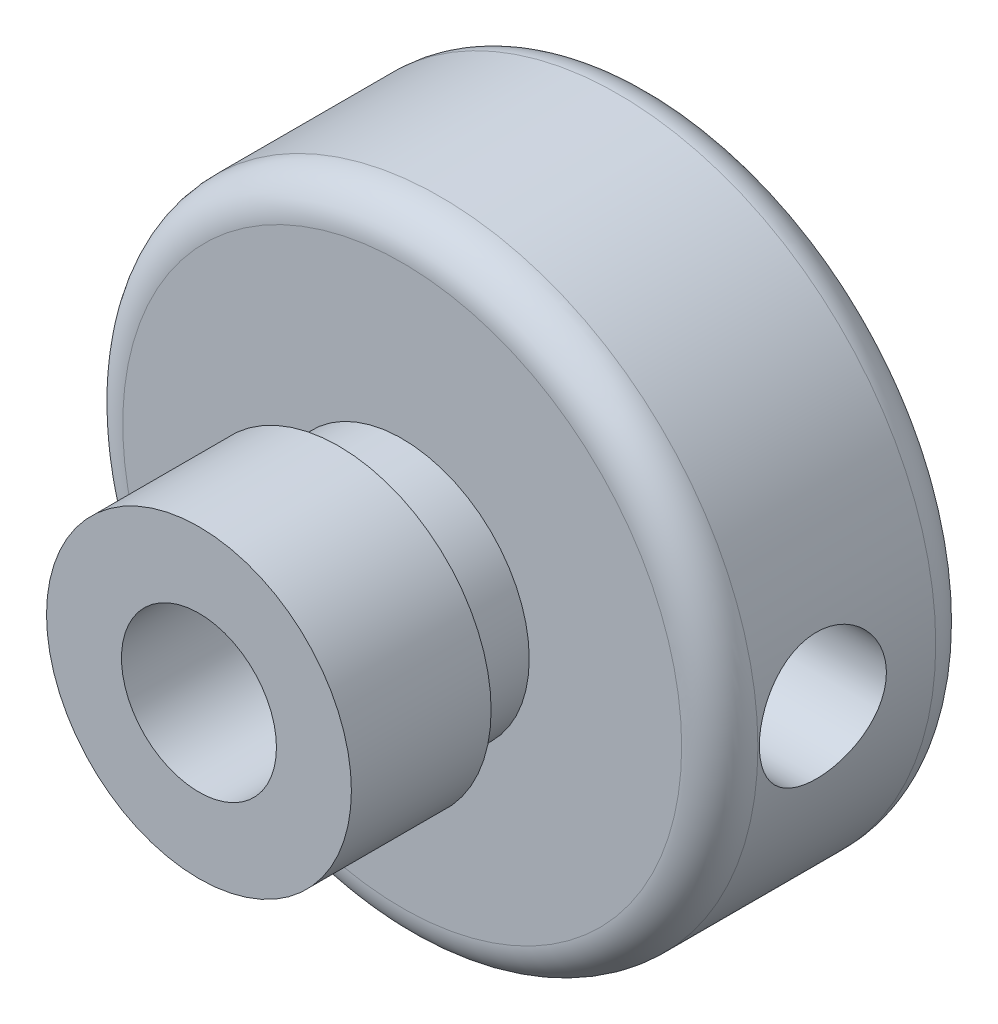
ISO-10303-21;
HEADER;
FILE_DESCRIPTION(('STEP AP214'),'2;1');
FILE_NAME('part.step','',(''),(''),'','','');
FILE_SCHEMA(('AUTOMOTIVE_DESIGN { 1 0 10303 214 1 1 1 1 }'));
ENDSEC;
DATA;
#1=APPLICATION_CONTEXT('core data for automotive mechanical design processes');
#2=APPLICATION_PROTOCOL_DEFINITION('international standard','automotive_design',2000,#1);
#3=PRODUCT_CONTEXT('',#1,'mechanical');
#4=PRODUCT('Part','Part','',(#3));
#5=PRODUCT_RELATED_PRODUCT_CATEGORY('part','',(#4));
#6=PRODUCT_DEFINITION_FORMATION('','',#4);
#7=PRODUCT_DEFINITION_CONTEXT('part definition',#1,'design');
#8=PRODUCT_DEFINITION('design','',#6,#7);
#9=PRODUCT_DEFINITION_SHAPE('','',#8);
#10=(LENGTH_UNIT() NAMED_UNIT(*) SI_UNIT(.MILLI.,.METRE.));
#11=(NAMED_UNIT(*) PLANE_ANGLE_UNIT() SI_UNIT($,.RADIAN.));
#12=(NAMED_UNIT(*) SI_UNIT($,.STERADIAN.) SOLID_ANGLE_UNIT());
#13=UNCERTAINTY_MEASURE_WITH_UNIT(LENGTH_MEASURE(1.E-05),#10,'distance_accuracy_value','');
#14=(GEOMETRIC_REPRESENTATION_CONTEXT(3) GLOBAL_UNCERTAINTY_ASSIGNED_CONTEXT((#13)) GLOBAL_UNIT_ASSIGNED_CONTEXT((#10,
#11,#12)) REPRESENTATION_CONTEXT('',''));
#15=CARTESIAN_POINT('',(0.,0.,0.));
#16=DIRECTION('',(0.,0.,1.));
#17=DIRECTION('',(1.,0.,0.));
#18=AXIS2_PLACEMENT_3D('',#15,#16,#17);
#19=CARTESIAN_POINT('',(0.,0.,0.));
#20=DIRECTION('',(0.,0.,1.));
#21=DIRECTION('',(1.,0.,0.));
#22=AXIS2_PLACEMENT_3D('',#19,#20,#21);
#23=CYLINDRICAL_SURFACE('',#22,3.05);
#24=CARTESIAN_POINT('',(0.,0.,18.));
#25=DIRECTION('',(0.,0.,1.));
#26=DIRECTION('',(1.,0.,0.));
#27=AXIS2_PLACEMENT_3D('',#24,#25,#26);
#28=CIRCLE('',#27,3.05);
#29=CARTESIAN_POINT('',(3.05,0.,18.));
#30=VERTEX_POINT('',#29);
#31=EDGE_CURVE('E133',#30,#30,#28,.T.);
#32=ORIENTED_EDGE('',*,*,#31,.T.);
#33=EDGE_LOOP('',(#32));
#34=FACE_BOUND('',#33,.T.);
#35=CARTESIAN_POINT('',(0.,0.,8.));
#36=DIRECTION('',(0.,0.,-1.));
#37=DIRECTION('',(-1.,0.,0.));
#38=AXIS2_PLACEMENT_3D('',#35,#36,#37);
#39=CIRCLE('',#38,3.05);
#40=CARTESIAN_POINT('',(-3.05,0.,8.));
#41=VERTEX_POINT('',#40);
#42=EDGE_CURVE('E132',#41,#41,#39,.F.);
#43=ORIENTED_EDGE('',*,*,#42,.F.);
#44=EDGE_LOOP('',(#43));
#45=FACE_BOUND('',#44,.T.);
#46=ADVANCED_FACE('F33',(#34,#45),#23,.F.);
#47=CARTESIAN_POINT('',(0.,0.,10.));
#48=DIRECTION('',(0.,0.,-1.));
#49=DIRECTION('',(-1.,0.,0.));
#50=AXIS2_PLACEMENT_3D('',#47,#48,#49);
#51=CYLINDRICAL_SURFACE('',#50,12.5);
#52=CARTESIAN_POINT('',(12.5,0.,3.44238683127572));
#53=CARTESIAN_POINT('',(12.4999974395218,-0.138942266981583,3.44239194252159));
#54=CARTESIAN_POINT('',(12.4976596294558,-0.277949150503806,3.45400893869484));
#55=CARTESIAN_POINT('',(12.4885591405808,-0.552033769222548,3.50013308156384));
#56=CARTESIAN_POINT('',(12.4817929465047,-0.687108293853389,3.5346584132795));
#57=CARTESIAN_POINT('',(12.4645912319572,-0.949325763158281,3.6254900153277));
#58=CARTESIAN_POINT('',(12.454159226918,-1.07647616983283,3.68177542338744));
#59=CARTESIAN_POINT('',(12.4307599508829,-1.31951997216056,3.81446745005396));
#60=CARTESIAN_POINT('',(12.4177928308927,-1.43541403768953,3.89087287029374));
#61=CARTESIAN_POINT('',(12.3905541332492,-1.65423369328716,4.06273306700431));
#62=CARTESIAN_POINT('',(12.3762686376087,-1.75698487789631,4.15840771975373));
#63=CARTESIAN_POINT('',(12.3481045113147,-1.94509189152007,4.36561787225498));
#64=CARTESIAN_POINT('',(12.3342259125106,-2.03044636192606,4.47715460961352));
#65=CARTESIAN_POINT('',(12.3083110453154,-2.18207938336905,4.71417731380541));
#66=CARTESIAN_POINT('',(12.2962926841237,-2.24817734716467,4.83978094076662));
#67=CARTESIAN_POINT('',(12.2756567014604,-2.35826416645077,5.10059137878592));
#68=CARTESIAN_POINT('',(12.267038744049,-2.40225520609309,5.23579723964159));
#69=CARTESIAN_POINT('',(12.2543201313051,-2.46631324971207,5.51009774104552));
#70=CARTESIAN_POINT('',(12.2501617526797,-2.48668624489694,5.64911819163129));
#71=CARTESIAN_POINT('',(12.2466593765157,-2.5038803193153,5.92866138468658));
#72=CARTESIAN_POINT('',(12.247314886696,-2.50070380678375,6.06918397207609));
#73=CARTESIAN_POINT('',(12.2533137787046,-2.47113643275455,6.34550380132823));
#74=CARTESIAN_POINT('',(12.2585863214691,-2.44509635060976,6.48134034534401));
#75=CARTESIAN_POINT('',(12.273113654,-2.37109471155763,6.74667702293323));
#76=CARTESIAN_POINT('',(12.2823686339445,-2.3231321077517,6.87617685357324));
#77=CARTESIAN_POINT('',(12.3038904625102,-2.2063119591868,7.12617498553472));
#78=CARTESIAN_POINT('',(12.3161772453426,-2.13731537808028,7.24660653019865));
#79=CARTESIAN_POINT('',(12.3423654693265,-1.9804839364317,7.47431395620776));
#80=CARTESIAN_POINT('',(12.3562670959591,-1.89264691089207,7.58158832340362));
#81=CARTESIAN_POINT('',(12.3844255310365,-1.69874983640146,7.78196033741806));
#82=CARTESIAN_POINT('',(12.3986842302726,-1.59239040303111,7.87476825092355));
#83=CARTESIAN_POINT('',(12.4257212178602,-1.36546256015503,8.04127144702878));
#84=CARTESIAN_POINT('',(12.4384994872243,-1.24489396844847,8.11496648450967));
#85=CARTESIAN_POINT('',(12.4611672540222,-0.992648467197302,8.24120560434066));
#86=CARTESIAN_POINT('',(12.4710522212068,-0.86095454896325,8.29371656538707));
#87=CARTESIAN_POINT('',(12.4867852246965,-0.590372441121662,8.37578801637214));
#88=CARTESIAN_POINT('',(12.4926337500133,-0.451485125181124,8.40535128645979));
#89=CARTESIAN_POINT('',(12.4995667966717,-0.172948514067876,8.44027796576141));
#90=CARTESIAN_POINT('',(12.5007293663117,-0.0333508208139412,8.44603788012639));
#91=CARTESIAN_POINT('',(12.4983762982526,0.244812335481784,8.43426218392027));
#92=CARTESIAN_POINT('',(12.4948609235362,0.383377856109483,8.41672788289423));
#93=CARTESIAN_POINT('',(12.4835958002004,0.654264149866352,8.35919089741583));
#94=CARTESIAN_POINT('',(12.4758844101052,0.786629870849757,8.31939166003096));
#95=CARTESIAN_POINT('',(12.4570888015258,1.04280906874917,8.2186768746362));
#96=CARTESIAN_POINT('',(12.4460043303557,1.16662190409385,8.15775974458365));
#97=CARTESIAN_POINT('',(12.4214977883324,1.40385293421554,8.01568060464744));
#98=CARTESIAN_POINT('',(12.4080487609263,1.51712531688047,7.93427987867836));
#99=CARTESIAN_POINT('',(12.3803683707471,1.72854504779802,7.75386385325752));
#100=CARTESIAN_POINT('',(12.3661369242097,1.82669077232691,7.65484666527605));
#101=CARTESIAN_POINT('',(12.3382325889241,2.00660147693544,7.44020345154791));
#102=CARTESIAN_POINT('',(12.3245715058326,2.08809425612164,7.32434747072238));
#103=CARTESIAN_POINT('',(12.2996047949049,2.23046355012801,7.08035842788403));
#104=CARTESIAN_POINT('',(12.2882990728336,2.29134088980726,6.95222585734184));
#105=CARTESIAN_POINT('',(12.2694185146096,2.3903796039549,6.68796621590185));
#106=CARTESIAN_POINT('',(12.2618243718047,2.42865874947763,6.55188472824992));
#107=CARTESIAN_POINT('',(12.2511859198006,2.48177162906799,6.27505319754846));
#108=CARTESIAN_POINT('',(12.2481410172778,2.49660842056278,6.13430376575235));
#109=CARTESIAN_POINT('',(12.2469787407845,2.50230227716867,5.85486466991493));
#110=CARTESIAN_POINT('',(12.2487729797325,2.49358947017724,5.7161839589582));
#111=CARTESIAN_POINT('',(12.2568893371153,2.45338076025015,5.44230770651316));
#112=CARTESIAN_POINT('',(12.2632114191792,2.42188504032325,5.30711213703871));
#113=CARTESIAN_POINT('',(12.279631605479,2.33719642124739,5.04431755317436));
#114=CARTESIAN_POINT('',(12.2897205254708,2.28405626679336,4.91670093001968));
#115=CARTESIAN_POINT('',(12.3125428743543,2.15763661150401,4.67212752943962));
#116=CARTESIAN_POINT('',(12.3252765249723,2.08435542193721,4.55517164696288));
#117=CARTESIAN_POINT('',(12.3522240130806,1.91826478696604,4.33309790089994));
#118=CARTESIAN_POINT('',(12.3664593227425,1.82514471808795,4.22821491810673));
#119=CARTESIAN_POINT('',(12.3946520467989,1.62266092253285,4.0354213174528));
#120=CARTESIAN_POINT('',(12.4086093965796,1.51329346788334,3.94751460548254));
#121=CARTESIAN_POINT('',(12.4348458096993,1.28004407272062,3.79030022140961));
#122=CARTESIAN_POINT('',(12.4471057804812,1.15602221107459,3.72119682307566));
#123=CARTESIAN_POINT('',(12.468378127125,0.897915902351832,3.60492152478424));
#124=CARTESIAN_POINT('',(12.4773934284654,0.763840652157816,3.55772985744449));
#125=CARTESIAN_POINT('',(12.4894093148843,0.52455372230945,3.49575696116393));
#126=CARTESIAN_POINT('',(12.4933575789613,0.420704160034462,3.47577884700633));
#127=CARTESIAN_POINT('',(12.4986538534973,0.211248813025168,3.44909205037981));
#128=CARTESIAN_POINT('',(12.5000019468289,0.105643084371548,3.4423829450013));
#129=CARTESIAN_POINT('',(12.5,0.,3.44238683127572));
#130=B_SPLINE_CURVE_WITH_KNOTS('',3,(#52,#53,#54,#55,#56,#57,#58,#59,#60,#61,#62,#63,#64,#65,
#66,#67,#68,#69,#70,#71,#72,#73,#74,#75,#76,#77,#78,#79,#80,#81,#82,#83,#84,#85,#86,#87,#88,#89,
#90,#91,#92,#93,#94,#95,#96,#97,#98,#99,#100,#101,#102,#103,#104,#105,#106,#107,#108,#109,#110,
#111,#112,#113,#114,#115,#116,#117,#118,#119,#120,#121,#122,#123,#124,#125,#126,#127,#128,#129),
.UNSPECIFIED.,.T.,.F.,(4,2,2,2,2,2,2,2,2,2,2,2,2,2,2,2,2,2,2,2,2,2,2,2,2,2,2,2,2,2,2,2,2,2,2,2,
2,2,4),(0.,0.416440326653146,0.833211626728307,1.24958433812585,1.66593225557716,
2.08733167528047,2.50876399186842,2.93402987514807,3.35925373412994,3.77890462758968,
4.19851260703063,4.61179317515696,5.02509348134324,5.44118725508981,5.85732886874176,
6.28095631228376,6.7045891884955,7.12888187135059,7.5531231424509,7.97026839190663,
8.38739019144669,8.80076134876808,9.21416348040056,9.63262665083396,10.0511347086482,
10.4760157144806,10.9008797180867,11.3235095258181,11.7460842082604,12.1609930641925,
12.5758985873152,12.9897990313277,13.4037341895467,13.8247019059786,14.2457663633233,
14.6712374168909,15.096323887938,15.4129693822473,15.7296047842749),.UNSPECIFIED.);
#131=CARTESIAN_POINT('',(12.5,0.,3.44238683127572));
#132=VERTEX_POINT('',#131);
#133=EDGE_CURVE('E111',#132,#132,#130,.T.);
#134=ORIENTED_EDGE('',*,*,#133,.T.);
#135=EDGE_LOOP('',(#134));
#136=FACE_BOUND('',#135,.T.);
#137=CARTESIAN_POINT('',(0.,0.,8.5));
#138=DIRECTION('',(0.,0.,1.));
#139=DIRECTION('',(1.,0.,0.));
#140=AXIS2_PLACEMENT_3D('',#137,#138,#139);
#141=CIRCLE('',#140,12.5);
#142=CARTESIAN_POINT('',(12.5,0.,8.5));
#143=VERTEX_POINT('',#142);
#144=EDGE_CURVE('E149',#143,#143,#141,.F.);
#145=ORIENTED_EDGE('',*,*,#144,.T.);
#146=EDGE_LOOP('',(#145));
#147=FACE_BOUND('',#146,.T.);
#148=CARTESIAN_POINT('',(0.,0.,1.5));
#149=DIRECTION('',(0.,0.,1.));
#150=DIRECTION('',(1.,0.,0.));
#151=AXIS2_PLACEMENT_3D('',#148,#149,#150);
#152=CIRCLE('',#151,12.5);
#153=CARTESIAN_POINT('',(12.5,0.,1.5));
#154=VERTEX_POINT('',#153);
#155=EDGE_CURVE('E146',#154,#154,#152,.T.);
#156=ORIENTED_EDGE('',*,*,#155,.T.);
#157=EDGE_LOOP('',(#156));
#158=FACE_BOUND('',#157,.T.);
#159=ADVANCED_FACE('F35',(#136,#147,#158),#51,.T.);
#160=CARTESIAN_POINT('',(0.,0.,10.));
#161=DIRECTION('',(0.,0.,1.));
#162=DIRECTION('',(1.,0.,0.));
#163=AXIS2_PLACEMENT_3D('',#160,#161,#162);
#164=PLANE('',#163);
#165=CARTESIAN_POINT('',(0.,0.,10.));
#166=DIRECTION('',(0.,0.,1.));
#167=DIRECTION('',(1.,0.,0.));
#168=AXIS2_PLACEMENT_3D('',#165,#166,#167);
#169=CIRCLE('',#168,11.);
#170=CARTESIAN_POINT('',(11.,0.,10.));
#171=VERTEX_POINT('',#170);
#172=EDGE_CURVE('E139',#171,#171,#169,.T.);
#173=ORIENTED_EDGE('',*,*,#172,.T.);
#174=EDGE_LOOP('',(#173));
#175=FACE_BOUND('',#174,.T.);
#176=CARTESIAN_POINT('',(0.,0.,10.));
#177=DIRECTION('',(0.,0.,1.));
#178=DIRECTION('',(1.,0.,0.));
#179=AXIS2_PLACEMENT_3D('',#176,#177,#178);
#180=CIRCLE('',#179,5.);
#181=CARTESIAN_POINT('',(5.,0.,10.));
#182=VERTEX_POINT('',#181);
#183=EDGE_CURVE('E117',#182,#182,#180,.T.);
#184=ORIENTED_EDGE('',*,*,#183,.F.);
#185=EDGE_LOOP('',(#184));
#186=FACE_BOUND('',#185,.T.);
#187=ADVANCED_FACE('F163',(#175,#186),#164,.T.);
#188=CARTESIAN_POINT('',(0.,0.,0.));
#189=DIRECTION('',(0.,0.,1.));
#190=DIRECTION('',(1.,0.,0.));
#191=AXIS2_PLACEMENT_3D('',#188,#189,#190);
#192=PLANE('',#191);
#193=CARTESIAN_POINT('',(0.,0.,0.));
#194=DIRECTION('',(0.,0.,1.));
#195=DIRECTION('',(1.,0.,0.));
#196=AXIS2_PLACEMENT_3D('',#193,#194,#195);
#197=CIRCLE('',#196,11.);
#198=CARTESIAN_POINT('',(11.,0.,0.));
#199=VERTEX_POINT('',#198);
#200=EDGE_CURVE('E79',#199,#199,#197,.F.);
#201=ORIENTED_EDGE('',*,*,#200,.T.);
#202=EDGE_LOOP('',(#201));
#203=FACE_BOUND('',#202,.T.);
#204=CARTESIAN_POINT('',(0.,0.,0.));
#205=DIRECTION('',(0.,0.,-1.));
#206=DIRECTION('',(-1.,0.,0.));
#207=AXIS2_PLACEMENT_3D('',#204,#205,#206);
#208=CIRCLE('',#207,5.);
#209=CARTESIAN_POINT('',(-5.,0.,0.));
#210=VERTEX_POINT('',#209);
#211=EDGE_CURVE('E126',#210,#210,#208,.T.);
#212=ORIENTED_EDGE('',*,*,#211,.F.);
#213=EDGE_LOOP('',(#212));
#214=FACE_BOUND('',#213,.T.);
#215=ADVANCED_FACE('F154',(#203,#214),#192,.F.);
#216=CARTESIAN_POINT('',(0.,0.,18.));
#217=DIRECTION('',(0.,0.,-1.));
#218=DIRECTION('',(-1.,0.,0.));
#219=AXIS2_PLACEMENT_3D('',#216,#217,#218);
#220=CYLINDRICAL_SURFACE('',#219,6.);
#221=CARTESIAN_POINT('',(0.,0.,12.5));
#222=DIRECTION('',(0.,0.,1.));
#223=DIRECTION('',(1.,0.,0.));
#224=AXIS2_PLACEMENT_3D('',#221,#222,#223);
#225=CIRCLE('',#224,6.);
#226=CARTESIAN_POINT('',(6.,0.,12.5));
#227=VERTEX_POINT('',#226);
#228=EDGE_CURVE('E125',#227,#227,#225,.T.);
#229=ORIENTED_EDGE('',*,*,#228,.T.);
#230=EDGE_LOOP('',(#229));
#231=FACE_BOUND('',#230,.T.);
#232=CARTESIAN_POINT('',(0.,0.,18.));
#233=DIRECTION('',(0.,0.,1.));
#234=DIRECTION('',(1.,0.,0.));
#235=AXIS2_PLACEMENT_3D('',#232,#233,#234);
#236=CIRCLE('',#235,6.);
#237=CARTESIAN_POINT('',(6.,0.,18.));
#238=VERTEX_POINT('',#237);
#239=EDGE_CURVE('E136',#238,#238,#236,.T.);
#240=ORIENTED_EDGE('',*,*,#239,.F.);
#241=EDGE_LOOP('',(#240));
#242=FACE_BOUND('',#241,.T.);
#243=ADVANCED_FACE('F173',(#231,#242),#220,.T.);
#244=CARTESIAN_POINT('',(0.,0.,18.));
#245=DIRECTION('',(0.,0.,1.));
#246=DIRECTION('',(1.,0.,0.));
#247=AXIS2_PLACEMENT_3D('',#244,#245,#246);
#248=PLANE('',#247);
#249=ORIENTED_EDGE('',*,*,#31,.F.);
#250=EDGE_LOOP('',(#249));
#251=FACE_BOUND('',#250,.T.);
#252=ORIENTED_EDGE('',*,*,#239,.T.);
#253=EDGE_LOOP('',(#252));
#254=FACE_BOUND('',#253,.T.);
#255=ADVANCED_FACE('F175',(#251,#254),#248,.T.);
#256=CARTESIAN_POINT('',(0.,0.,8.));
#257=DIRECTION('',(0.,0.,-1.));
#258=DIRECTION('',(-1.,0.,0.));
#259=AXIS2_PLACEMENT_3D('',#256,#257,#258);
#260=PLANE('',#259);
#261=DIRECTION('',(1.,0.,0.));
#262=VECTOR('',#261,1.);
#263=CARTESIAN_POINT('',(4.5,1.41993945219239,8.));
#264=LINE('',#263,#262);
#265=CARTESIAN_POINT('',(4.5,1.41993945219239,8.));
#266=VERTEX_POINT('',#265);
#267=CARTESIAN_POINT('',(4.79413933382287,1.41993945219239,8.));
#268=VERTEX_POINT('',#267);
#269=EDGE_CURVE('E318',#266,#268,#264,.T.);
#270=ORIENTED_EDGE('',*,*,#269,.F.);
#271=DIRECTION('',(0.,-1.,0.));
#272=VECTOR('',#271,1.);
#273=CARTESIAN_POINT('',(4.5,0.,8.));
#274=LINE('',#273,#272);
#275=CARTESIAN_POINT('',(4.5,-1.41993945219239,8.));
#276=VERTEX_POINT('',#275);
#277=EDGE_CURVE('E84',#266,#276,#274,.T.);
#278=ORIENTED_EDGE('',*,*,#277,.T.);
#279=DIRECTION('',(1.,0.,0.));
#280=VECTOR('',#279,1.);
#281=CARTESIAN_POINT('',(4.5,-1.41993945219239,8.));
#282=LINE('',#281,#280);
#283=CARTESIAN_POINT('',(4.79413933382287,-1.41993945219239,8.));
#284=VERTEX_POINT('',#283);
#285=EDGE_CURVE('E118',#284,#276,#282,.F.);
#286=ORIENTED_EDGE('',*,*,#285,.F.);
#287=CARTESIAN_POINT('',(0.,0.,8.));
#288=DIRECTION('',(0.,0.,-1.));
#289=DIRECTION('',(-1.,0.,0.));
#290=AXIS2_PLACEMENT_3D('',#287,#288,#289);
#291=CIRCLE('',#290,5.);
#292=EDGE_CURVE('E129',#284,#268,#291,.T.);
#293=ORIENTED_EDGE('',*,*,#292,.T.);
#294=EDGE_LOOP('',(#270,#278,#286,#293));
#295=FACE_BOUND('',#294,.T.);
#296=ORIENTED_EDGE('',*,*,#42,.T.);
#297=EDGE_LOOP('',(#296));
#298=FACE_BOUND('',#297,.T.);
#299=ADVANCED_FACE('F181',(#295,#298),#260,.T.);
#300=CARTESIAN_POINT('',(0.,0.,8.));
#301=DIRECTION('',(0.,0.,-1.));
#302=DIRECTION('',(-1.,0.,0.));
#303=AXIS2_PLACEMENT_3D('',#300,#301,#302);
#304=CYLINDRICAL_SURFACE('',#303,5.);
#305=ORIENTED_EDGE('',*,*,#292,.F.);
#306=CARTESIAN_POINT('',(4.79413933382287,-1.41993945219239,8.));
#307=CARTESIAN_POINT('',(4.77655996089364,-1.47930136138851,7.95902831162597));
#308=CARTESIAN_POINT('',(4.75834782199795,-1.53673101951028,7.91560960861671));
#309=CARTESIAN_POINT('',(4.721143881774,-1.64748584479755,7.82413006668995));
#310=CARTESIAN_POINT('',(4.70215215949917,-1.70081142656689,7.77606969779391));
#311=CARTESIAN_POINT('',(4.64461872469648,-1.85458883293783,7.62499668171361));
#312=CARTESIAN_POINT('',(4.60562720859519,-1.9484913413855,7.51533455784374));
#313=CARTESIAN_POINT('',(4.53087047637844,-2.11653142604822,7.28072575189006));
#314=CARTESIAN_POINT('',(4.49510759243871,-2.19065478936225,7.1557681723459));
#315=CARTESIAN_POINT('',(4.4315055242799,-2.31662578626764,6.89335805604077));
#316=CARTESIAN_POINT('',(4.40365267152929,-2.36851192576748,6.75592762153562));
#317=CARTESIAN_POINT('',(4.36133359504557,-2.44553191395599,6.47978817435405));
#318=CARTESIAN_POINT('',(4.34623305774843,-2.47194412070764,6.34153763239991));
#319=CARTESIAN_POINT('',(4.32953111809469,-2.50109478087077,6.06177643044485));
#320=CARTESIAN_POINT('',(4.32791972088575,-2.50385076253044,5.92026826217537));
#321=CARTESIAN_POINT('',(4.33780652479476,-2.48666036512735,5.65617140715458));
#322=CARTESIAN_POINT('',(4.3477654941512,-2.46938001912149,5.53333753232926));
#323=CARTESIAN_POINT('',(4.37697426521896,-2.41722577186975,5.29262366029399));
#324=CARTESIAN_POINT('',(4.39622663794524,-2.38234700190861,5.17474504376957));
#325=CARTESIAN_POINT('',(4.44228064590369,-2.29534360351897,4.94389742401076));
#326=CARTESIAN_POINT('',(4.46924874040471,-2.24283370207454,4.83110839806881));
#327=CARTESIAN_POINT('',(4.52770293359269,-2.12235364459475,4.61539960169002));
#328=CARTESIAN_POINT('',(4.55919108715114,-2.05437644867859,4.51248435568403));
#329=CARTESIAN_POINT('',(4.62796234833281,-1.89484063783585,4.30570720683528));
#330=CARTESIAN_POINT('',(4.66547398754848,-1.80138486859599,4.20337990069127));
#331=CARTESIAN_POINT('',(4.73882765359854,-1.59848434274929,4.01521191252293));
#332=CARTESIAN_POINT('',(4.77466887739855,-1.48903199842739,3.92937909936815));
#333=CARTESIAN_POINT('',(4.8426724306601,-1.25081753282901,3.77289954762644));
#334=CARTESIAN_POINT('',(4.8745872609208,-1.12139556334419,3.70314102707603));
#335=CARTESIAN_POINT('',(4.9290357592232,-0.850653060511689,3.58695916576694));
#336=CARTESIAN_POINT('',(4.95157688195921,-0.709342090168991,3.54051727570983));
#337=CARTESIAN_POINT('',(4.98315387065333,-0.431389758702803,3.47610663036501));
#338=CARTESIAN_POINT('',(4.99315413157228,-0.295331898241308,3.45609721322713));
#339=CARTESIAN_POINT('',(5.00182731982083,-0.0214421813138462,3.43872111839824));
#340=CARTESIAN_POINT('',(5.00050560513829,0.116388805209043,3.44134373037787));
#341=CARTESIAN_POINT('',(4.98724343648285,0.37856028353877,3.46797676110344));
#342=CARTESIAN_POINT('',(4.97613341908258,0.503118771528213,3.49031478747817));
#343=CARTESIAN_POINT('',(4.94548596943431,0.746468645191635,3.5531231823809));
#344=CARTESIAN_POINT('',(4.92594760671366,0.865259392507046,3.59359555292376));
#345=CARTESIAN_POINT('',(4.87951119512694,1.09764396561878,3.69258879943122));
#346=CARTESIAN_POINT('',(4.85241826962092,1.21099127968091,3.7515936935675));
#347=CARTESIAN_POINT('',(4.79348089999766,1.42655099046984,3.88543106072513));
#348=CARTESIAN_POINT('',(4.76163443179458,1.52875861161825,3.96027028178884));
#349=CARTESIAN_POINT('',(4.69257158127251,1.72978202281084,4.13213393176063));
#350=CARTESIAN_POINT('',(4.6551349885867,1.82727880260687,4.23061535752733));
#351=CARTESIAN_POINT('',(4.58142133300633,2.00495649063851,4.44262087335488));
#352=CARTESIAN_POINT('',(4.54514508506741,2.08512544691579,4.55615525973682));
#353=CARTESIAN_POINT('',(4.47615580421366,2.22951771875272,4.80198066415584));
#354=CARTESIAN_POINT('',(4.44369984523292,2.29278268772615,4.93491314099942));
#355=CARTESIAN_POINT('',(4.38926462411454,2.39536604570968,5.21168285263222));
#356=CARTESIAN_POINT('',(4.36727194074993,2.4347151296744,5.35550584203558));
#357=CARTESIAN_POINT('',(4.33899980801871,2.48471969949187,5.63519512193248));
#358=CARTESIAN_POINT('',(4.33141395946823,2.49776825783799,5.77049873316401));
#359=CARTESIAN_POINT('',(4.32914579147421,2.50170219302502,6.04150658505762));
#360=CARTESIAN_POINT('',(4.33445739549845,2.49259800695105,6.17721060698064));
#361=CARTESIAN_POINT('',(4.35599736827806,2.45472539499762,6.43154464745474));
#362=CARTESIAN_POINT('',(4.37113780826994,2.42791243747795,6.55056984262871));
#363=CARTESIAN_POINT('',(4.40935464690245,2.3577904612943,6.78232252091847));
#364=CARTESIAN_POINT('',(4.43243483369625,2.31447356733152,6.89504696796977));
#365=CARTESIAN_POINT('',(4.48582781804811,2.20930852901377,7.11938925933713));
#366=CARTESIAN_POINT('',(4.51652371144824,2.14640672235452,7.23041859416814));
#367=CARTESIAN_POINT('',(4.58103434605989,2.00503126863866,7.44103097492826));
#368=CARTESIAN_POINT('',(4.61484884860426,1.92655881267544,7.5406148954669));
#369=CARTESIAN_POINT('',(4.67365734527809,1.77806528373695,7.70226257896116));
#370=CARTESIAN_POINT('',(4.69863273142288,1.71124747774754,7.76730687435643));
#371=CARTESIAN_POINT('',(4.74747824236434,1.57067077105858,7.88960314018513));
#372=CARTESIAN_POINT('',(4.77135011922651,1.49692347973225,7.94686776405291));
#373=CARTESIAN_POINT('',(4.79413933382287,1.41993945219239,8.));
#374=B_SPLINE_CURVE_WITH_KNOTS('',3,(#306,#307,#308,#309,#310,#311,#312,#313,#314,#315,#316,
#317,#318,#319,#320,#321,#322,#323,#324,#325,#326,#327,#328,#329,#330,#331,#332,#333,#334,#335,
#336,#337,#338,#339,#340,#341,#342,#343,#344,#345,#346,#347,#348,#349,#350,#351,#352,#353,#354,
#355,#356,#357,#358,#359,#360,#361,#362,#363,#364,#365,#366,#367,#368,#369,#370,#371,#372,#373),
.UNSPECIFIED.,.F.,.F.,(4,2,2,2,2,2,2,2,2,2,2,2,2,2,2,2,2,2,2,2,2,2,2,2,2,2,2,2,2,2,2,2,2,4),(0.,
0.222567600233405,0.445112686548212,0.89150449447408,1.33821621212192,1.78415124878523,
2.20632081047656,2.62817753560223,2.99976672751473,3.37145877834108,3.75186790205283,
4.1324505151162,4.56129004663796,4.99033365539284,5.43926245129228,5.88783353848167,
6.29923089364332,6.7104335707482,7.08978529881309,7.46917891728145,7.85944575986673,
8.24987925689371,8.67865864428257,9.10773284733468,9.55755210160722,10.0067928073695,
10.4128824256009,10.8187807550646,11.1860200907615,11.5534348845389,11.9456549713417,
12.3378450664105,12.626911638641,12.9155022740539),.UNSPECIFIED.);
#375=CARTESIAN_POINT('',(4.5,-2.17944947177033,7.16713170266732));
#376=VERTEX_POINT('',#375);
#377=EDGE_CURVE('E11',#284,#376,#374,.T.);
#378=ORIENTED_EDGE('',*,*,#377,.T.);
#379=DIRECTION('',(0.,0.,-1.));
#380=VECTOR('',#379,1.);
#381=CARTESIAN_POINT('',(4.5,-2.17944947177033,8.));
#382=LINE('',#381,#380);
#383=CARTESIAN_POINT('',(4.5,-2.17944947177033,4.71764195988413));
#384=VERTEX_POINT('',#383);
#385=EDGE_CURVE('E38',#384,#376,#382,.F.);
#386=ORIENTED_EDGE('',*,*,#385,.F.);
#387=CARTESIAN_POINT('',(4.5,2.17944947177033,4.71764195988413));
#388=VERTEX_POINT('',#387);
#389=EDGE_CURVE('E43',#384,#388,#374,.T.);
#390=ORIENTED_EDGE('',*,*,#389,.T.);
#391=DIRECTION('',(0.,0.,-1.));
#392=VECTOR('',#391,1.);
#393=CARTESIAN_POINT('',(4.5,2.17944947177033,8.));
#394=LINE('',#393,#392);
#395=CARTESIAN_POINT('',(4.5,2.17944947177033,7.16713170266732));
#396=VERTEX_POINT('',#395);
#397=EDGE_CURVE('E74',#396,#388,#394,.T.);
#398=ORIENTED_EDGE('',*,*,#397,.F.);
#399=EDGE_CURVE('E44',#396,#268,#374,.T.);
#400=ORIENTED_EDGE('',*,*,#399,.T.);
#401=EDGE_LOOP('',(#305,#378,#386,#390,#398,#400));
#402=FACE_BOUND('',#401,.T.);
#403=ORIENTED_EDGE('',*,*,#211,.T.);
#404=EDGE_LOOP('',(#403));
#405=FACE_BOUND('',#404,.T.);
#406=ADVANCED_FACE('F90',(#402,#405),#304,.F.);
#407=CARTESIAN_POINT('',(0.,5.,12.5));
#408=DIRECTION('',(0.,0.,1.));
#409=DIRECTION('',(1.,0.,0.));
#410=AXIS2_PLACEMENT_3D('',#407,#408,#409);
#411=PLANE('',#410);
#412=CARTESIAN_POINT('',(0.,0.,12.5));
#413=DIRECTION('',(0.,0.,1.));
#414=DIRECTION('',(1.,0.,0.));
#415=AXIS2_PLACEMENT_3D('',#412,#413,#414);
#416=CIRCLE('',#415,5.);
#417=CARTESIAN_POINT('',(5.,0.,12.5));
#418=VERTEX_POINT('',#417);
#419=EDGE_CURVE('E122',#418,#418,#416,.T.);
#420=ORIENTED_EDGE('',*,*,#419,.T.);
#421=EDGE_LOOP('',(#420));
#422=FACE_BOUND('',#421,.T.);
#423=ORIENTED_EDGE('',*,*,#228,.F.);
#424=EDGE_LOOP('',(#423));
#425=FACE_BOUND('',#424,.T.);
#426=ADVANCED_FACE('F199',(#422,#425),#411,.F.);
#427=CARTESIAN_POINT('',(0.,0.,21.3998267273121));
#428=DIRECTION('',(0.,0.,1.));
#429=DIRECTION('',(1.,0.,0.));
#430=AXIS2_PLACEMENT_3D('',#427,#428,#429);
#431=CYLINDRICAL_SURFACE('',#430,5.);
#432=ORIENTED_EDGE('',*,*,#183,.T.);
#433=EDGE_LOOP('',(#432));
#434=FACE_BOUND('',#433,.T.);
#435=ORIENTED_EDGE('',*,*,#419,.F.);
#436=EDGE_LOOP('',(#435));
#437=FACE_BOUND('',#436,.T.);
#438=ADVANCED_FACE('F204',(#434,#437),#431,.T.);
#439=CARTESIAN_POINT('',(0.,0.,8.5));
#440=DIRECTION('',(0.,0.,1.));
#441=DIRECTION('',(1.,0.,0.));
#442=AXIS2_PLACEMENT_3D('',#439,#440,#441);
#443=TOROIDAL_SURFACE('',#442,11.,1.5);
#444=ORIENTED_EDGE('',*,*,#144,.F.);
#445=EDGE_LOOP('',(#444));
#446=FACE_BOUND('',#445,.T.);
#447=ORIENTED_EDGE('',*,*,#172,.F.);
#448=EDGE_LOOP('',(#447));
#449=FACE_BOUND('',#448,.T.);
#450=ADVANCED_FACE('F159',(#446,#449),#443,.T.);
#451=CARTESIAN_POINT('',(0.,0.,1.5));
#452=DIRECTION('',(0.,0.,1.));
#453=DIRECTION('',(1.,0.,0.));
#454=AXIS2_PLACEMENT_3D('',#451,#452,#453);
#455=TOROIDAL_SURFACE('',#454,11.,1.5);
#456=ORIENTED_EDGE('',*,*,#200,.F.);
#457=EDGE_LOOP('',(#456));
#458=FACE_BOUND('',#457,.T.);
#459=ORIENTED_EDGE('',*,*,#155,.F.);
#460=EDGE_LOOP('',(#459));
#461=FACE_BOUND('',#460,.T.);
#462=ADVANCED_FACE('F106',(#458,#461),#455,.T.);
#463=CARTESIAN_POINT('',(4.5,0.,5.94238683127572));
#464=DIRECTION('',(1.,0.,0.));
#465=DIRECTION('',(0.,0.,-1.));
#466=AXIS2_PLACEMENT_3D('',#463,#464,#465);
#467=CYLINDRICAL_SURFACE('',#466,2.5);
#468=ORIENTED_EDGE('',*,*,#285,.T.);
#469=CARTESIAN_POINT('',(4.5,0.,5.94238683127572));
#470=DIRECTION('',(1.,0.,0.));
#471=DIRECTION('',(0.,0.,-1.));
#472=AXIS2_PLACEMENT_3D('',#469,#470,#471);
#473=CIRCLE('',#472,2.5);
#474=EDGE_CURVE('E85',#266,#276,#473,.T.);
#475=ORIENTED_EDGE('',*,*,#474,.F.);
#476=ORIENTED_EDGE('',*,*,#269,.T.);
#477=ORIENTED_EDGE('',*,*,#399,.F.);
#478=EDGE_CURVE('E50',#388,#396,#473,.T.);
#479=ORIENTED_EDGE('',*,*,#478,.F.);
#480=ORIENTED_EDGE('',*,*,#389,.F.);
#481=EDGE_CURVE('E87',#376,#384,#473,.T.);
#482=ORIENTED_EDGE('',*,*,#481,.F.);
#483=ORIENTED_EDGE('',*,*,#377,.F.);
#484=EDGE_LOOP('',(#468,#475,#476,#477,#479,#480,#482,#483));
#485=FACE_BOUND('',#484,.T.);
#486=ORIENTED_EDGE('',*,*,#133,.F.);
#487=EDGE_LOOP('',(#486));
#488=FACE_BOUND('',#487,.T.);
#489=ADVANCED_FACE('F81',(#485,#488),#467,.F.);
#490=CARTESIAN_POINT('',(4.5,0.,5.94238683127572));
#491=DIRECTION('',(1.,0.,0.));
#492=DIRECTION('',(0.,0.,-1.));
#493=AXIS2_PLACEMENT_3D('',#490,#491,#492);
#494=PLANE('',#493);
#495=ORIENTED_EDGE('',*,*,#385,.T.);
#496=ORIENTED_EDGE('',*,*,#481,.T.);
#497=EDGE_LOOP('',(#495,#496));
#498=FACE_BOUND('',#497,.T.);
#499=ADVANCED_FACE('F105',(#498),#494,.T.);
#500=ORIENTED_EDGE('',*,*,#397,.T.);
#501=ORIENTED_EDGE('',*,*,#478,.T.);
#502=EDGE_LOOP('',(#500,#501));
#503=FACE_BOUND('',#502,.T.);
#504=ADVANCED_FACE('F75',(#503),#494,.T.);
#505=ORIENTED_EDGE('',*,*,#474,.T.);
#506=ORIENTED_EDGE('',*,*,#277,.F.);
#507=EDGE_LOOP('',(#505,#506));
#508=FACE_BOUND('',#507,.T.);
#509=ADVANCED_FACE('F107',(#508),#494,.T.);
#510=CLOSED_SHELL('',(#46,#159,#187,#215,#243,#255,#299,#406,#426,#438,#450,#462,#489,#499,#504,#509));
#511=MANIFOLD_SOLID_BREP('B2',#510);
#512=ADVANCED_BREP_SHAPE_REPRESENTATION('',(#18,#511),#14);
#513=SHAPE_DEFINITION_REPRESENTATION(#9,#512);
ENDSEC;
END-ISO-10303-21;
